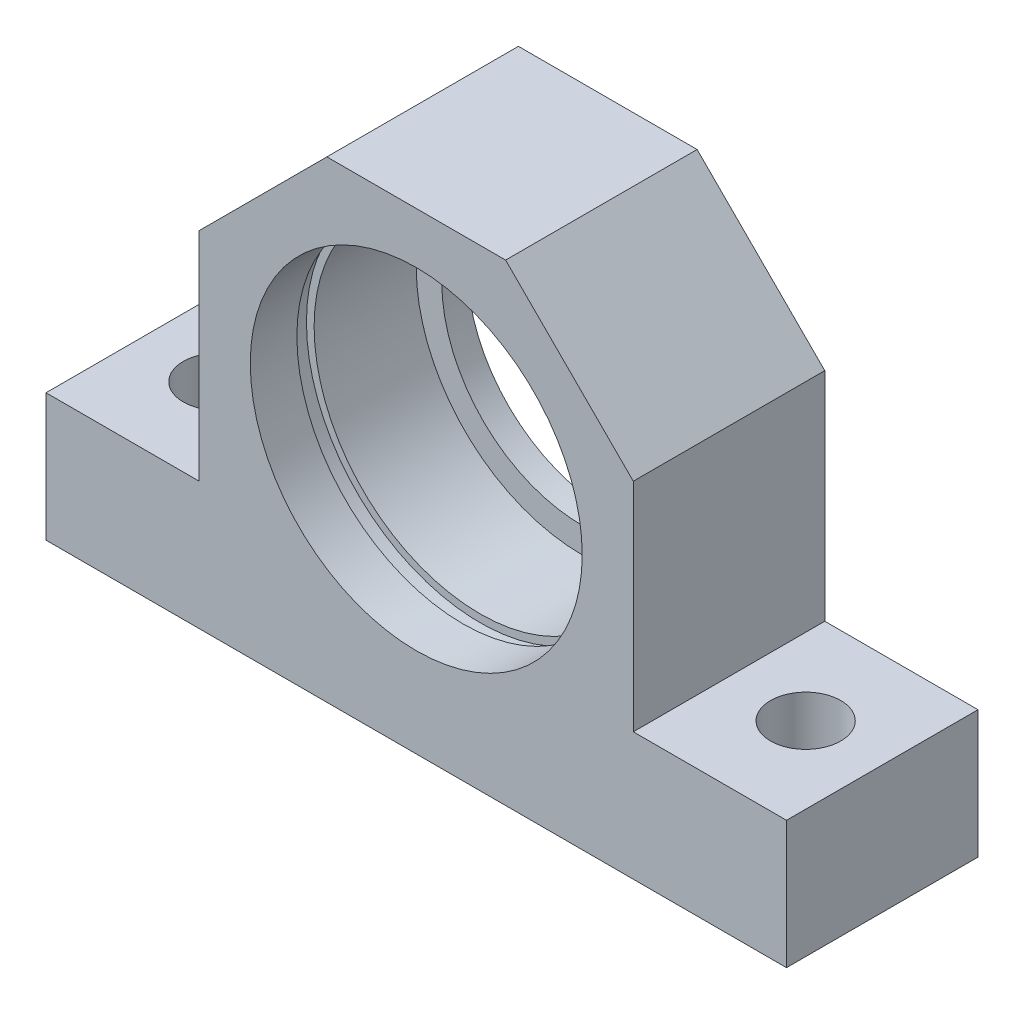
ISO-10303-21;
HEADER;
FILE_DESCRIPTION(('STEP AP214'),'2;1');
FILE_NAME('part.step','',(''),(''),'','','');
FILE_SCHEMA(('AUTOMOTIVE_DESIGN { 1 0 10303 214 1 1 1 1 }'));
ENDSEC;
DATA;
#1=APPLICATION_CONTEXT('core data for automotive mechanical design processes');
#2=APPLICATION_PROTOCOL_DEFINITION('international standard','automotive_design',2000,#1);
#3=PRODUCT_CONTEXT('',#1,'mechanical');
#4=PRODUCT('Part','Part','',(#3));
#5=PRODUCT_RELATED_PRODUCT_CATEGORY('part','',(#4));
#6=PRODUCT_DEFINITION_FORMATION('','',#4);
#7=PRODUCT_DEFINITION_CONTEXT('part definition',#1,'design');
#8=PRODUCT_DEFINITION('design','',#6,#7);
#9=PRODUCT_DEFINITION_SHAPE('','',#8);
#10=(LENGTH_UNIT() NAMED_UNIT(*) SI_UNIT(.MILLI.,.METRE.));
#11=(NAMED_UNIT(*) PLANE_ANGLE_UNIT() SI_UNIT($,.RADIAN.));
#12=(NAMED_UNIT(*) SI_UNIT($,.STERADIAN.) SOLID_ANGLE_UNIT());
#13=UNCERTAINTY_MEASURE_WITH_UNIT(LENGTH_MEASURE(1.E-05),#10,'distance_accuracy_value','');
#14=(GEOMETRIC_REPRESENTATION_CONTEXT(3) GLOBAL_UNCERTAINTY_ASSIGNED_CONTEXT((#13)) GLOBAL_UNIT_ASSIGNED_CONTEXT((#10,
#11,#12)) REPRESENTATION_CONTEXT('',''));
#15=CARTESIAN_POINT('',(0.,0.,0.));
#16=DIRECTION('',(0.,0.,1.));
#17=DIRECTION('',(1.,0.,0.));
#18=AXIS2_PLACEMENT_3D('',#15,#16,#17);
#19=CARTESIAN_POINT('',(-17.,9.99999999999999,-15.));
#20=DIRECTION('',(-1.,0.,0.));
#21=DIRECTION('',(0.,-1.,0.));
#22=AXIS2_PLACEMENT_3D('',#19,#20,#21);
#23=PLANE('',#22);
#24=DIRECTION('',(0.,-1.,0.));
#25=VECTOR('',#24,1.);
#26=CARTESIAN_POINT('',(-17.,9.99999999999999,0.));
#27=LINE('',#26,#25);
#28=CARTESIAN_POINT('',(-17.,27.,0.));
#29=VERTEX_POINT('',#28);
#30=CARTESIAN_POINT('',(-17.,9.99999999999999,0.));
#31=VERTEX_POINT('',#30);
#32=EDGE_CURVE('E146',#29,#31,#27,.T.);
#33=ORIENTED_EDGE('',*,*,#32,.F.);
#34=DIRECTION('',(0.,0.,-1.));
#35=VECTOR('',#34,1.);
#36=CARTESIAN_POINT('',(-17.,27.,-15.));
#37=LINE('',#36,#35);
#38=CARTESIAN_POINT('',(-17.,27.,-15.));
#39=VERTEX_POINT('',#38);
#40=EDGE_CURVE('E11',#29,#39,#37,.T.);
#41=ORIENTED_EDGE('',*,*,#40,.T.);
#42=DIRECTION('',(0.,-1.,0.));
#43=VECTOR('',#42,1.);
#44=CARTESIAN_POINT('',(-17.,9.99999999999999,-15.));
#45=LINE('',#44,#43);
#46=CARTESIAN_POINT('',(-17.,9.99999999999999,-15.));
#47=VERTEX_POINT('',#46);
#48=EDGE_CURVE('E108',#39,#47,#45,.T.);
#49=ORIENTED_EDGE('',*,*,#48,.T.);
#50=DIRECTION('',(0.,0.,1.));
#51=VECTOR('',#50,1.);
#52=CARTESIAN_POINT('',(-17.,9.99999999999999,-15.));
#53=LINE('',#52,#51);
#54=EDGE_CURVE('E110',#47,#31,#53,.T.);
#55=ORIENTED_EDGE('',*,*,#54,.T.);
#56=EDGE_LOOP('',(#33,#41,#49,#55));
#57=FACE_BOUND('',#56,.T.);
#58=ADVANCED_FACE('F33',(#57),#23,.T.);
#59=CARTESIAN_POINT('',(-17.,37.,-15.));
#60=DIRECTION('',(0.,1.,0.));
#61=DIRECTION('',(-1.,0.,0.));
#62=AXIS2_PLACEMENT_3D('',#59,#60,#61);
#63=PLANE('',#62);
#64=DIRECTION('',(-1.,0.,0.));
#65=VECTOR('',#64,1.);
#66=CARTESIAN_POINT('',(-17.,37.,0.));
#67=LINE('',#66,#65);
#68=CARTESIAN_POINT('',(6.99999999999997,37.,0.));
#69=VERTEX_POINT('',#68);
#70=CARTESIAN_POINT('',(-7.,37.,0.));
#71=VERTEX_POINT('',#70);
#72=EDGE_CURVE('E114',#69,#71,#67,.T.);
#73=ORIENTED_EDGE('',*,*,#72,.F.);
#74=DIRECTION('',(0.,0.,-1.));
#75=VECTOR('',#74,1.);
#76=CARTESIAN_POINT('',(6.99999999999997,37.,-15.));
#77=LINE('',#76,#75);
#78=CARTESIAN_POINT('',(6.99999999999997,37.,-15.));
#79=VERTEX_POINT('',#78);
#80=EDGE_CURVE('E186',#69,#79,#77,.T.);
#81=ORIENTED_EDGE('',*,*,#80,.T.);
#82=DIRECTION('',(-1.,0.,0.));
#83=VECTOR('',#82,1.);
#84=CARTESIAN_POINT('',(-17.,37.,-15.));
#85=LINE('',#84,#83);
#86=CARTESIAN_POINT('',(-7.,37.,-15.));
#87=VERTEX_POINT('',#86);
#88=EDGE_CURVE('E122',#79,#87,#85,.T.);
#89=ORIENTED_EDGE('',*,*,#88,.T.);
#90=DIRECTION('',(0.,0.,1.));
#91=VECTOR('',#90,1.);
#92=CARTESIAN_POINT('',(-7.,37.,-15.));
#93=LINE('',#92,#91);
#94=EDGE_CURVE('E183',#87,#71,#93,.T.);
#95=ORIENTED_EDGE('',*,*,#94,.T.);
#96=EDGE_LOOP('',(#73,#81,#89,#95));
#97=FACE_BOUND('',#96,.T.);
#98=ADVANCED_FACE('F202',(#97),#63,.T.);
#99=CARTESIAN_POINT('',(17.,37.,-15.));
#100=DIRECTION('',(1.,0.,0.));
#101=DIRECTION('',(0.,1.,0.));
#102=AXIS2_PLACEMENT_3D('',#99,#100,#101);
#103=PLANE('',#102);
#104=DIRECTION('',(0.,1.,0.));
#105=VECTOR('',#104,1.);
#106=CARTESIAN_POINT('',(17.,37.,-15.));
#107=LINE('',#106,#105);
#108=CARTESIAN_POINT('',(17.,10.,-15.));
#109=VERTEX_POINT('',#108);
#110=CARTESIAN_POINT('',(17.,27.,-15.));
#111=VERTEX_POINT('',#110);
#112=EDGE_CURVE('E142',#109,#111,#107,.T.);
#113=ORIENTED_EDGE('',*,*,#112,.T.);
#114=DIRECTION('',(0.,0.,1.));
#115=VECTOR('',#114,1.);
#116=CARTESIAN_POINT('',(17.,27.,-15.));
#117=LINE('',#116,#115);
#118=CARTESIAN_POINT('',(17.,27.,0.));
#119=VERTEX_POINT('',#118);
#120=EDGE_CURVE('E169',#111,#119,#117,.T.);
#121=ORIENTED_EDGE('',*,*,#120,.T.);
#122=DIRECTION('',(0.,1.,0.));
#123=VECTOR('',#122,1.);
#124=CARTESIAN_POINT('',(17.,37.,0.));
#125=LINE('',#124,#123);
#126=CARTESIAN_POINT('',(17.,10.,0.));
#127=VERTEX_POINT('',#126);
#128=EDGE_CURVE('E162',#127,#119,#125,.T.);
#129=ORIENTED_EDGE('',*,*,#128,.F.);
#130=DIRECTION('',(0.,0.,1.));
#131=VECTOR('',#130,1.);
#132=CARTESIAN_POINT('',(17.,10.,-15.));
#133=LINE('',#132,#131);
#134=EDGE_CURVE('E167',#109,#127,#133,.T.);
#135=ORIENTED_EDGE('',*,*,#134,.F.);
#136=EDGE_LOOP('',(#113,#121,#129,#135));
#137=FACE_BOUND('',#136,.T.);
#138=ADVANCED_FACE('F195',(#137),#103,.T.);
#139=CARTESIAN_POINT('',(17.,10.,-15.));
#140=DIRECTION('',(0.,1.,0.));
#141=DIRECTION('',(-1.,0.,0.));
#142=AXIS2_PLACEMENT_3D('',#139,#140,#141);
#143=PLANE('',#142);
#144=CARTESIAN_POINT('',(23.,10.,-7.5));
#145=DIRECTION('',(0.,1.,0.));
#146=DIRECTION('',(0.,0.,1.));
#147=AXIS2_PLACEMENT_3D('',#144,#145,#146);
#148=CIRCLE('',#147,2.74999999999999);
#149=CARTESIAN_POINT('',(23.,10.,-4.75000000000001));
#150=VERTEX_POINT('',#149);
#151=EDGE_CURVE('E315',#150,#150,#148,.T.);
#152=ORIENTED_EDGE('',*,*,#151,.F.);
#153=EDGE_LOOP('',(#152));
#154=FACE_BOUND('',#153,.T.);
#155=DIRECTION('',(-1.,0.,0.));
#156=VECTOR('',#155,1.);
#157=CARTESIAN_POINT('',(17.,10.,0.));
#158=LINE('',#157,#156);
#159=CARTESIAN_POINT('',(29.,9.99999999999999,0.));
#160=VERTEX_POINT('',#159);
#161=EDGE_CURVE('E159',#160,#127,#158,.T.);
#162=ORIENTED_EDGE('',*,*,#161,.F.);
#163=DIRECTION('',(0.,0.,1.));
#164=VECTOR('',#163,1.);
#165=CARTESIAN_POINT('',(29.,9.99999999999999,-15.));
#166=LINE('',#165,#164);
#167=CARTESIAN_POINT('',(29.,9.99999999999999,-15.));
#168=VERTEX_POINT('',#167);
#169=EDGE_CURVE('E170',#168,#160,#166,.T.);
#170=ORIENTED_EDGE('',*,*,#169,.F.);
#171=DIRECTION('',(-1.,0.,0.));
#172=VECTOR('',#171,1.);
#173=CARTESIAN_POINT('',(17.,10.,-15.));
#174=LINE('',#173,#172);
#175=EDGE_CURVE('E139',#168,#109,#174,.T.);
#176=ORIENTED_EDGE('',*,*,#175,.T.);
#177=ORIENTED_EDGE('',*,*,#134,.T.);
#178=EDGE_LOOP('',(#162,#170,#176,#177));
#179=FACE_BOUND('',#178,.T.);
#180=ADVANCED_FACE('F217',(#154,#179),#143,.T.);
#181=CARTESIAN_POINT('',(29.,9.99999999999999,-15.));
#182=DIRECTION('',(1.,0.,0.));
#183=DIRECTION('',(0.,0.,-1.));
#184=AXIS2_PLACEMENT_3D('',#181,#182,#183);
#185=PLANE('',#184);
#186=DIRECTION('',(0.,1.,0.));
#187=VECTOR('',#186,1.);
#188=CARTESIAN_POINT('',(29.,9.99999999999999,0.));
#189=LINE('',#188,#187);
#190=CARTESIAN_POINT('',(29.,0.,0.));
#191=VERTEX_POINT('',#190);
#192=EDGE_CURVE('E156',#191,#160,#189,.T.);
#193=ORIENTED_EDGE('',*,*,#192,.F.);
#194=DIRECTION('',(0.,0.,1.));
#195=VECTOR('',#194,1.);
#196=CARTESIAN_POINT('',(29.,0.,-15.));
#197=LINE('',#196,#195);
#198=CARTESIAN_POINT('',(29.,0.,-15.));
#199=VERTEX_POINT('',#198);
#200=EDGE_CURVE('E172',#199,#191,#197,.T.);
#201=ORIENTED_EDGE('',*,*,#200,.F.);
#202=DIRECTION('',(0.,1.,0.));
#203=VECTOR('',#202,1.);
#204=CARTESIAN_POINT('',(29.,9.99999999999999,-15.));
#205=LINE('',#204,#203);
#206=EDGE_CURVE('E136',#199,#168,#205,.T.);
#207=ORIENTED_EDGE('',*,*,#206,.T.);
#208=ORIENTED_EDGE('',*,*,#169,.T.);
#209=EDGE_LOOP('',(#193,#201,#207,#208));
#210=FACE_BOUND('',#209,.T.);
#211=ADVANCED_FACE('F214',(#210),#185,.T.);
#212=CARTESIAN_POINT('',(29.,0.,-15.));
#213=DIRECTION('',(0.,-1.,0.));
#214=DIRECTION('',(0.,0.,-1.));
#215=AXIS2_PLACEMENT_3D('',#212,#213,#214);
#216=PLANE('',#215);
#217=CARTESIAN_POINT('',(-23.,0.,-7.5));
#218=DIRECTION('',(0.,1.,0.));
#219=DIRECTION('',(0.,0.,1.));
#220=AXIS2_PLACEMENT_3D('',#217,#218,#219);
#221=CIRCLE('',#220,2.75);
#222=CARTESIAN_POINT('',(-23.,0.,-4.75));
#223=VERTEX_POINT('',#222);
#224=EDGE_CURVE('E318',#223,#223,#221,.T.);
#225=ORIENTED_EDGE('',*,*,#224,.T.);
#226=EDGE_LOOP('',(#225));
#227=FACE_BOUND('',#226,.T.);
#228=CARTESIAN_POINT('',(23.,0.,-7.5));
#229=DIRECTION('',(0.,1.,0.));
#230=DIRECTION('',(0.,0.,1.));
#231=AXIS2_PLACEMENT_3D('',#228,#229,#230);
#232=CIRCLE('',#231,2.75);
#233=CARTESIAN_POINT('',(23.,0.,-4.75));
#234=VERTEX_POINT('',#233);
#235=EDGE_CURVE('E312',#234,#234,#232,.T.);
#236=ORIENTED_EDGE('',*,*,#235,.T.);
#237=EDGE_LOOP('',(#236));
#238=FACE_BOUND('',#237,.T.);
#239=DIRECTION('',(1.,0.,0.));
#240=VECTOR('',#239,1.);
#241=CARTESIAN_POINT('',(29.,0.,0.));
#242=LINE('',#241,#240);
#243=CARTESIAN_POINT('',(-29.,0.,0.));
#244=VERTEX_POINT('',#243);
#245=EDGE_CURVE('E153',#244,#191,#242,.T.);
#246=ORIENTED_EDGE('',*,*,#245,.F.);
#247=DIRECTION('',(0.,0.,1.));
#248=VECTOR('',#247,1.);
#249=CARTESIAN_POINT('',(-29.,0.,-15.));
#250=LINE('',#249,#248);
#251=CARTESIAN_POINT('',(-29.,0.,-15.));
#252=VERTEX_POINT('',#251);
#253=EDGE_CURVE('E174',#252,#244,#250,.T.);
#254=ORIENTED_EDGE('',*,*,#253,.F.);
#255=DIRECTION('',(1.,0.,0.));
#256=VECTOR('',#255,1.);
#257=CARTESIAN_POINT('',(29.,0.,-15.));
#258=LINE('',#257,#256);
#259=EDGE_CURVE('E130',#252,#199,#258,.T.);
#260=ORIENTED_EDGE('',*,*,#259,.T.);
#261=ORIENTED_EDGE('',*,*,#200,.T.);
#262=EDGE_LOOP('',(#246,#254,#260,#261));
#263=FACE_BOUND('',#262,.T.);
#264=ADVANCED_FACE('F210',(#227,#238,#263),#216,.T.);
#265=CARTESIAN_POINT('',(-29.,0.,-15.));
#266=DIRECTION('',(-1.,0.,0.));
#267=DIRECTION('',(0.,0.,1.));
#268=AXIS2_PLACEMENT_3D('',#265,#266,#267);
#269=PLANE('',#268);
#270=DIRECTION('',(0.,-1.,0.));
#271=VECTOR('',#270,1.);
#272=CARTESIAN_POINT('',(-29.,0.,0.));
#273=LINE('',#272,#271);
#274=CARTESIAN_POINT('',(-29.,9.99999999999999,0.));
#275=VERTEX_POINT('',#274);
#276=EDGE_CURVE('E150',#275,#244,#273,.T.);
#277=ORIENTED_EDGE('',*,*,#276,.F.);
#278=DIRECTION('',(0.,0.,1.));
#279=VECTOR('',#278,1.);
#280=CARTESIAN_POINT('',(-29.,9.99999999999999,-15.));
#281=LINE('',#280,#279);
#282=CARTESIAN_POINT('',(-29.,9.99999999999999,-15.));
#283=VERTEX_POINT('',#282);
#284=EDGE_CURVE('E121',#283,#275,#281,.T.);
#285=ORIENTED_EDGE('',*,*,#284,.F.);
#286=DIRECTION('',(0.,-1.,0.));
#287=VECTOR('',#286,1.);
#288=CARTESIAN_POINT('',(-29.,0.,-15.));
#289=LINE('',#288,#287);
#290=EDGE_CURVE('E128',#283,#252,#289,.T.);
#291=ORIENTED_EDGE('',*,*,#290,.T.);
#292=ORIENTED_EDGE('',*,*,#253,.T.);
#293=EDGE_LOOP('',(#277,#285,#291,#292));
#294=FACE_BOUND('',#293,.T.);
#295=ADVANCED_FACE('F208',(#294),#269,.T.);
#296=CARTESIAN_POINT('',(-29.,9.99999999999999,-15.));
#297=DIRECTION('',(0.,1.,0.));
#298=DIRECTION('',(0.,0.,1.));
#299=AXIS2_PLACEMENT_3D('',#296,#297,#298);
#300=PLANE('',#299);
#301=CARTESIAN_POINT('',(-23.,10.,-7.5));
#302=DIRECTION('',(0.,1.,0.));
#303=DIRECTION('',(0.,0.,1.));
#304=AXIS2_PLACEMENT_3D('',#301,#302,#303);
#305=CIRCLE('',#304,2.74999999999999);
#306=CARTESIAN_POINT('',(-23.,10.,-4.75000000000001));
#307=VERTEX_POINT('',#306);
#308=EDGE_CURVE('E321',#307,#307,#305,.T.);
#309=ORIENTED_EDGE('',*,*,#308,.F.);
#310=EDGE_LOOP('',(#309));
#311=FACE_BOUND('',#310,.T.);
#312=DIRECTION('',(-1.,0.,0.));
#313=VECTOR('',#312,1.);
#314=CARTESIAN_POINT('',(-29.,9.99999999999999,0.));
#315=LINE('',#314,#313);
#316=EDGE_CURVE('E120',#31,#275,#315,.T.);
#317=ORIENTED_EDGE('',*,*,#316,.F.);
#318=ORIENTED_EDGE('',*,*,#54,.F.);
#319=DIRECTION('',(-1.,0.,0.));
#320=VECTOR('',#319,1.);
#321=CARTESIAN_POINT('',(-29.,9.99999999999999,-15.));
#322=LINE('',#321,#320);
#323=EDGE_CURVE('E113',#47,#283,#322,.T.);
#324=ORIENTED_EDGE('',*,*,#323,.T.);
#325=ORIENTED_EDGE('',*,*,#284,.T.);
#326=EDGE_LOOP('',(#317,#318,#324,#325));
#327=FACE_BOUND('',#326,.T.);
#328=ADVANCED_FACE('F118',(#311,#327),#300,.T.);
#329=CARTESIAN_POINT('',(0.,0.,-15.));
#330=DIRECTION('',(0.,0.,-1.));
#331=DIRECTION('',(-1.,0.,0.));
#332=AXIS2_PLACEMENT_3D('',#329,#330,#331);
#333=PLANE('',#332);
#334=CARTESIAN_POINT('',(0.,20.,-15.));
#335=DIRECTION('',(0.,0.,-1.));
#336=DIRECTION('',(-1.,0.,0.));
#337=AXIS2_PLACEMENT_3D('',#334,#335,#336);
#338=CIRCLE('',#337,11.);
#339=CARTESIAN_POINT('',(-11.,20.,-15.));
#340=VERTEX_POINT('',#339);
#341=EDGE_CURVE('E290',#340,#340,#338,.T.);
#342=ORIENTED_EDGE('',*,*,#341,.F.);
#343=EDGE_LOOP('',(#342));
#344=FACE_BOUND('',#343,.T.);
#345=ORIENTED_EDGE('',*,*,#88,.F.);
#346=DIRECTION('',(-0.707106781186549,0.707106781186546,0.));
#347=VECTOR('',#346,1.);
#348=CARTESIAN_POINT('',(22.,22.,-15.));
#349=LINE('',#348,#347);
#350=EDGE_CURVE('E41',#79,#111,#349,.F.);
#351=ORIENTED_EDGE('',*,*,#350,.T.);
#352=ORIENTED_EDGE('',*,*,#112,.F.);
#353=ORIENTED_EDGE('',*,*,#175,.F.);
#354=ORIENTED_EDGE('',*,*,#206,.F.);
#355=ORIENTED_EDGE('',*,*,#259,.F.);
#356=ORIENTED_EDGE('',*,*,#290,.F.);
#357=ORIENTED_EDGE('',*,*,#323,.F.);
#358=ORIENTED_EDGE('',*,*,#48,.F.);
#359=DIRECTION('',(-0.707106781186546,-0.707106781186549,0.));
#360=VECTOR('',#359,1.);
#361=CARTESIAN_POINT('',(-22.,21.9999999999999,-15.));
#362=LINE('',#361,#360);
#363=EDGE_CURVE('E53',#39,#87,#362,.F.);
#364=ORIENTED_EDGE('',*,*,#363,.T.);
#365=EDGE_LOOP('',(#345,#351,#352,#353,#354,#355,#356,#357,#358,#364));
#366=FACE_BOUND('',#365,.T.);
#367=ADVANCED_FACE('F125',(#344,#366),#333,.T.);
#368=CARTESIAN_POINT('',(0.,0.,0.));
#369=DIRECTION('',(0.,0.,-1.));
#370=DIRECTION('',(-1.,0.,0.));
#371=AXIS2_PLACEMENT_3D('',#368,#369,#370);
#372=PLANE('',#371);
#373=CARTESIAN_POINT('',(0.,20.,0.));
#374=DIRECTION('',(0.,0.,-1.));
#375=DIRECTION('',(-1.,0.,0.));
#376=AXIS2_PLACEMENT_3D('',#373,#374,#375);
#377=CIRCLE('',#376,13.);
#378=CARTESIAN_POINT('',(-13.,20.,0.));
#379=VERTEX_POINT('',#378);
#380=EDGE_CURVE('E148',#379,#379,#377,.T.);
#381=ORIENTED_EDGE('',*,*,#380,.T.);
#382=EDGE_LOOP('',(#381));
#383=FACE_BOUND('',#382,.T.);
#384=ORIENTED_EDGE('',*,*,#128,.T.);
#385=DIRECTION('',(0.707106781186549,-0.707106781186546,0.));
#386=VECTOR('',#385,1.);
#387=CARTESIAN_POINT('',(17.,27.,0.));
#388=LINE('',#387,#386);
#389=EDGE_CURVE('E181',#119,#69,#388,.F.);
#390=ORIENTED_EDGE('',*,*,#389,.T.);
#391=ORIENTED_EDGE('',*,*,#72,.T.);
#392=DIRECTION('',(0.707106781186546,0.707106781186549,0.));
#393=VECTOR('',#392,1.);
#394=CARTESIAN_POINT('',(-7.,37.,0.));
#395=LINE('',#394,#393);
#396=EDGE_CURVE('E179',#71,#29,#395,.F.);
#397=ORIENTED_EDGE('',*,*,#396,.T.);
#398=ORIENTED_EDGE('',*,*,#32,.T.);
#399=ORIENTED_EDGE('',*,*,#316,.T.);
#400=ORIENTED_EDGE('',*,*,#276,.T.);
#401=ORIENTED_EDGE('',*,*,#245,.T.);
#402=ORIENTED_EDGE('',*,*,#192,.T.);
#403=ORIENTED_EDGE('',*,*,#161,.T.);
#404=EDGE_LOOP('',(#384,#390,#391,#397,#398,#399,#400,#401,#402,#403));
#405=FACE_BOUND('',#404,.T.);
#406=ADVANCED_FACE('F200',(#383,#405),#372,.F.);
#407=CARTESIAN_POINT('',(0.,20.,-15.));
#408=DIRECTION('',(0.,0.,-1.));
#409=DIRECTION('',(-1.,0.,0.));
#410=AXIS2_PLACEMENT_3D('',#407,#408,#409);
#411=CYLINDRICAL_SURFACE('',#410,13.);
#412=ORIENTED_EDGE('',*,*,#380,.F.);
#413=EDGE_LOOP('',(#412));
#414=FACE_BOUND('',#413,.T.);
#415=CARTESIAN_POINT('',(0.,20.,-3.65));
#416=DIRECTION('',(0.,0.,-1.));
#417=DIRECTION('',(-1.,0.,0.));
#418=AXIS2_PLACEMENT_3D('',#415,#416,#417);
#419=CIRCLE('',#418,13.);
#420=CARTESIAN_POINT('',(-13.,20.,-3.65));
#421=VERTEX_POINT('',#420);
#422=EDGE_CURVE('E309',#421,#421,#419,.T.);
#423=ORIENTED_EDGE('',*,*,#422,.T.);
#424=EDGE_LOOP('',(#423));
#425=FACE_BOUND('',#424,.T.);
#426=ADVANCED_FACE('F276',(#414,#425),#411,.F.);
#427=CARTESIAN_POINT('',(0.,20.,-15.));
#428=DIRECTION('',(0.,0.,-1.));
#429=DIRECTION('',(-1.,0.,0.));
#430=AXIS2_PLACEMENT_3D('',#427,#428,#429);
#431=CYLINDRICAL_SURFACE('',#430,11.);
#432=CARTESIAN_POINT('',(0.,20.,-13.));
#433=DIRECTION('',(0.,0.,-1.));
#434=DIRECTION('',(-1.,0.,0.));
#435=AXIS2_PLACEMENT_3D('',#432,#433,#434);
#436=CIRCLE('',#435,11.);
#437=CARTESIAN_POINT('',(-11.,20.,-13.));
#438=VERTEX_POINT('',#437);
#439=EDGE_CURVE('E292',#438,#438,#436,.T.);
#440=ORIENTED_EDGE('',*,*,#439,.F.);
#441=EDGE_LOOP('',(#440));
#442=FACE_BOUND('',#441,.T.);
#443=ORIENTED_EDGE('',*,*,#341,.T.);
#444=EDGE_LOOP('',(#443));
#445=FACE_BOUND('',#444,.T.);
#446=ADVANCED_FACE('F272',(#442,#445),#431,.F.);
#447=CARTESIAN_POINT('',(0.,33.,-13.));
#448=DIRECTION('',(0.,0.,-1.));
#449=DIRECTION('',(-1.,0.,0.));
#450=AXIS2_PLACEMENT_3D('',#447,#448,#449);
#451=PLANE('',#450);
#452=CARTESIAN_POINT('',(0.,20.,-13.));
#453=DIRECTION('',(0.,0.,-1.));
#454=DIRECTION('',(-1.,0.,0.));
#455=AXIS2_PLACEMENT_3D('',#452,#453,#454);
#456=CIRCLE('',#455,13.);
#457=CARTESIAN_POINT('',(-13.,20.,-13.));
#458=VERTEX_POINT('',#457);
#459=EDGE_CURVE('E297',#458,#458,#456,.T.);
#460=ORIENTED_EDGE('',*,*,#459,.F.);
#461=EDGE_LOOP('',(#460));
#462=FACE_BOUND('',#461,.T.);
#463=ORIENTED_EDGE('',*,*,#439,.T.);
#464=EDGE_LOOP('',(#463));
#465=FACE_BOUND('',#464,.T.);
#466=ADVANCED_FACE('F268',(#462,#465),#451,.F.);
#467=CARTESIAN_POINT('',(0.,20.,-15.));
#468=DIRECTION('',(0.,0.,-1.));
#469=DIRECTION('',(-1.,0.,0.));
#470=AXIS2_PLACEMENT_3D('',#467,#468,#469);
#471=CYLINDRICAL_SURFACE('',#470,13.);
#472=CARTESIAN_POINT('',(0.,20.,-5.));
#473=DIRECTION('',(0.,0.,-1.));
#474=DIRECTION('',(-1.,0.,0.));
#475=AXIS2_PLACEMENT_3D('',#472,#473,#474);
#476=CIRCLE('',#475,13.);
#477=CARTESIAN_POINT('',(-13.,20.,-5.));
#478=VERTEX_POINT('',#477);
#479=EDGE_CURVE('E300',#478,#478,#476,.T.);
#480=ORIENTED_EDGE('',*,*,#479,.F.);
#481=EDGE_LOOP('',(#480));
#482=FACE_BOUND('',#481,.T.);
#483=ORIENTED_EDGE('',*,*,#459,.T.);
#484=EDGE_LOOP('',(#483));
#485=FACE_BOUND('',#484,.T.);
#486=ADVANCED_FACE('F264',(#482,#485),#471,.F.);
#487=CARTESIAN_POINT('',(0.,33.6,-5.));
#488=DIRECTION('',(0.,0.,-1.));
#489=DIRECTION('',(-1.,0.,0.));
#490=AXIS2_PLACEMENT_3D('',#487,#488,#489);
#491=PLANE('',#490);
#492=CARTESIAN_POINT('',(0.,20.,-5.));
#493=DIRECTION('',(0.,0.,-1.));
#494=DIRECTION('',(-1.,0.,0.));
#495=AXIS2_PLACEMENT_3D('',#492,#493,#494);
#496=CIRCLE('',#495,13.6);
#497=CARTESIAN_POINT('',(-13.6,20.,-5.));
#498=VERTEX_POINT('',#497);
#499=EDGE_CURVE('E303',#498,#498,#496,.T.);
#500=ORIENTED_EDGE('',*,*,#499,.F.);
#501=EDGE_LOOP('',(#500));
#502=FACE_BOUND('',#501,.T.);
#503=ORIENTED_EDGE('',*,*,#479,.T.);
#504=EDGE_LOOP('',(#503));
#505=FACE_BOUND('',#504,.T.);
#506=ADVANCED_FACE('F260',(#502,#505),#491,.F.);
#507=CARTESIAN_POINT('',(0.,20.,-15.));
#508=DIRECTION('',(0.,0.,-1.));
#509=DIRECTION('',(-1.,0.,0.));
#510=AXIS2_PLACEMENT_3D('',#507,#508,#509);
#511=CYLINDRICAL_SURFACE('',#510,13.6);
#512=CARTESIAN_POINT('',(0.,20.,-3.65));
#513=DIRECTION('',(0.,0.,-1.));
#514=DIRECTION('',(-1.,0.,0.));
#515=AXIS2_PLACEMENT_3D('',#512,#513,#514);
#516=CIRCLE('',#515,13.6);
#517=CARTESIAN_POINT('',(-13.6,20.,-3.65));
#518=VERTEX_POINT('',#517);
#519=EDGE_CURVE('E306',#518,#518,#516,.T.);
#520=ORIENTED_EDGE('',*,*,#519,.F.);
#521=EDGE_LOOP('',(#520));
#522=FACE_BOUND('',#521,.T.);
#523=ORIENTED_EDGE('',*,*,#499,.T.);
#524=EDGE_LOOP('',(#523));
#525=FACE_BOUND('',#524,.T.);
#526=ADVANCED_FACE('F256',(#522,#525),#511,.F.);
#527=CARTESIAN_POINT('',(0.,33.,-3.65));
#528=DIRECTION('',(0.,0.,1.));
#529=DIRECTION('',(1.,0.,0.));
#530=AXIS2_PLACEMENT_3D('',#527,#528,#529);
#531=PLANE('',#530);
#532=ORIENTED_EDGE('',*,*,#422,.F.);
#533=EDGE_LOOP('',(#532));
#534=FACE_BOUND('',#533,.T.);
#535=ORIENTED_EDGE('',*,*,#519,.T.);
#536=EDGE_LOOP('',(#535));
#537=FACE_BOUND('',#536,.T.);
#538=ADVANCED_FACE('F248',(#534,#537),#531,.F.);
#539=CARTESIAN_POINT('',(23.,9.99999999999999,-7.5));
#540=DIRECTION('',(0.,1.,0.));
#541=DIRECTION('',(0.,0.,1.));
#542=AXIS2_PLACEMENT_3D('',#539,#540,#541);
#543=CYLINDRICAL_SURFACE('',#542,2.74999999999999);
#544=ORIENTED_EDGE('',*,*,#235,.F.);
#545=EDGE_LOOP('',(#544));
#546=FACE_BOUND('',#545,.T.);
#547=ORIENTED_EDGE('',*,*,#151,.T.);
#548=EDGE_LOOP('',(#547));
#549=FACE_BOUND('',#548,.T.);
#550=ADVANCED_FACE('F242',(#546,#549),#543,.F.);
#551=CARTESIAN_POINT('',(-23.,9.99999999999999,-7.5));
#552=DIRECTION('',(0.,1.,0.));
#553=DIRECTION('',(0.,0.,1.));
#554=AXIS2_PLACEMENT_3D('',#551,#552,#553);
#555=CYLINDRICAL_SURFACE('',#554,2.74999999999999);
#556=ORIENTED_EDGE('',*,*,#224,.F.);
#557=EDGE_LOOP('',(#556));
#558=FACE_BOUND('',#557,.T.);
#559=ORIENTED_EDGE('',*,*,#308,.T.);
#560=EDGE_LOOP('',(#559));
#561=FACE_BOUND('',#560,.T.);
#562=ADVANCED_FACE('F237',(#558,#561),#555,.F.);
#563=CARTESIAN_POINT('',(17.,27.,-15.));
#564=DIRECTION('',(-0.707106781186546,-0.707106781186549,0.));
#565=DIRECTION('',(0.,0.,1.));
#566=AXIS2_PLACEMENT_3D('',#563,#564,#565);
#567=PLANE('',#566);
#568=ORIENTED_EDGE('',*,*,#350,.F.);
#569=ORIENTED_EDGE('',*,*,#80,.F.);
#570=ORIENTED_EDGE('',*,*,#389,.F.);
#571=ORIENTED_EDGE('',*,*,#120,.F.);
#572=EDGE_LOOP('',(#568,#569,#570,#571));
#573=FACE_BOUND('',#572,.T.);
#574=ADVANCED_FACE('F197',(#573),#567,.F.);
#575=CARTESIAN_POINT('',(-7.,37.,-15.));
#576=DIRECTION('',(0.707106781186549,-0.707106781186546,0.));
#577=DIRECTION('',(0.,0.,1.));
#578=AXIS2_PLACEMENT_3D('',#575,#576,#577);
#579=PLANE('',#578);
#580=ORIENTED_EDGE('',*,*,#363,.F.);
#581=ORIENTED_EDGE('',*,*,#40,.F.);
#582=ORIENTED_EDGE('',*,*,#396,.F.);
#583=ORIENTED_EDGE('',*,*,#94,.F.);
#584=EDGE_LOOP('',(#580,#581,#582,#583));
#585=FACE_BOUND('',#584,.T.);
#586=ADVANCED_FACE('F35',(#585),#579,.F.);
#587=CLOSED_SHELL('',(#58,#98,#138,#180,#211,#264,#295,#328,#367,#406,#426,#446,#466,#486,#506,
#526,#538,#550,#562,#574,#586));
#588=MANIFOLD_SOLID_BREP('B2',#587);
#589=ADVANCED_BREP_SHAPE_REPRESENTATION('',(#18,#588),#14);
#590=SHAPE_DEFINITION_REPRESENTATION(#9,#589);
ENDSEC;
END-ISO-10303-21;
